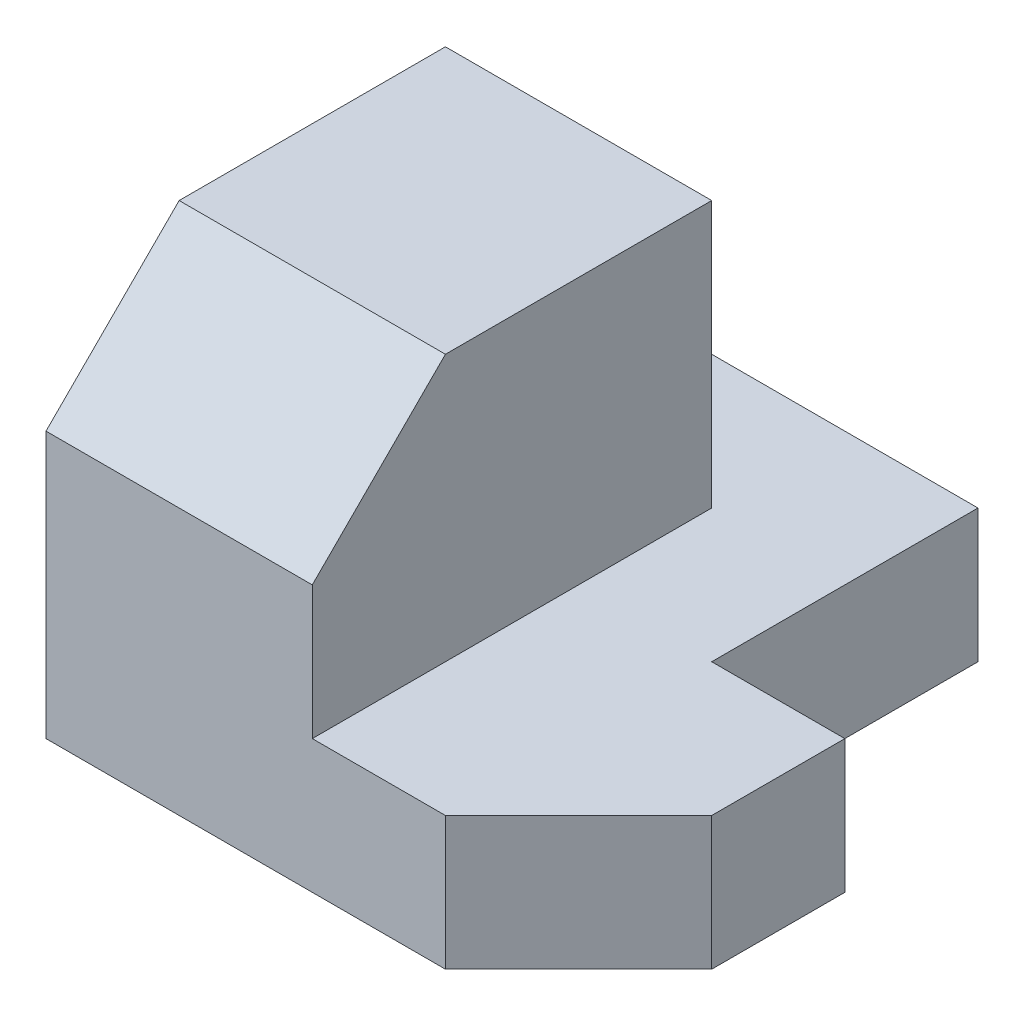
ISO-10303-21;
HEADER;
FILE_DESCRIPTION(('STEP AP214'),'2;1');
FILE_NAME('part.step','',(''),(''),'','','');
FILE_SCHEMA(('AUTOMOTIVE_DESIGN { 1 0 10303 214 1 1 1 1 }'));
ENDSEC;
DATA;
#1=APPLICATION_CONTEXT('core data for automotive mechanical design processes');
#2=APPLICATION_PROTOCOL_DEFINITION('international standard','automotive_design',2000,#1);
#3=PRODUCT_CONTEXT('',#1,'mechanical');
#4=PRODUCT('Part','Part','',(#3));
#5=PRODUCT_RELATED_PRODUCT_CATEGORY('part','',(#4));
#6=PRODUCT_DEFINITION_FORMATION('','',#4);
#7=PRODUCT_DEFINITION_CONTEXT('part definition',#1,'design');
#8=PRODUCT_DEFINITION('design','',#6,#7);
#9=PRODUCT_DEFINITION_SHAPE('','',#8);
#10=(LENGTH_UNIT() NAMED_UNIT(*) SI_UNIT(.MILLI.,.METRE.));
#11=(NAMED_UNIT(*) PLANE_ANGLE_UNIT() SI_UNIT($,.RADIAN.));
#12=(NAMED_UNIT(*) SI_UNIT($,.STERADIAN.) SOLID_ANGLE_UNIT());
#13=UNCERTAINTY_MEASURE_WITH_UNIT(LENGTH_MEASURE(1.E-05),#10,'distance_accuracy_value','');
#14=(GEOMETRIC_REPRESENTATION_CONTEXT(3) GLOBAL_UNCERTAINTY_ASSIGNED_CONTEXT((#13)) GLOBAL_UNIT_ASSIGNED_CONTEXT((#10,
#11,#12)) REPRESENTATION_CONTEXT('',''));
#15=CARTESIAN_POINT('',(0.,0.,0.));
#16=DIRECTION('',(0.,0.,1.));
#17=DIRECTION('',(1.,0.,0.));
#18=AXIS2_PLACEMENT_3D('',#15,#16,#17);
#19=CARTESIAN_POINT('',(0.,5.,0.));
#20=DIRECTION('',(0.,-1.,0.));
#21=DIRECTION('',(0.,0.,-1.));
#22=AXIS2_PLACEMENT_3D('',#19,#20,#21);
#23=PLANE('',#22);
#24=DIRECTION('',(-1.,0.,0.));
#25=VECTOR('',#24,1.);
#26=CARTESIAN_POINT('',(10.,5.,-15.));
#27=LINE('',#26,#25);
#28=CARTESIAN_POINT('',(10.,5.,-15.));
#29=VERTEX_POINT('',#28);
#30=CARTESIAN_POINT('',(0.,5.,-15.));
#31=VERTEX_POINT('',#30);
#32=EDGE_CURVE('E137',#29,#31,#27,.T.);
#33=ORIENTED_EDGE('',*,*,#32,.F.);
#34=DIRECTION('',(0.,0.,1.));
#35=VECTOR('',#34,1.);
#36=CARTESIAN_POINT('',(10.,5.,0.));
#37=LINE('',#36,#35);
#38=CARTESIAN_POINT('',(10.,5.,0.));
#39=VERTEX_POINT('',#38);
#40=EDGE_CURVE('E186',#29,#39,#37,.T.);
#41=ORIENTED_EDGE('',*,*,#40,.T.);
#42=DIRECTION('',(1.,0.,0.));
#43=VECTOR('',#42,1.);
#44=CARTESIAN_POINT('',(0.,5.,0.));
#45=LINE('',#44,#43);
#46=CARTESIAN_POINT('',(15.,5.,0.));
#47=VERTEX_POINT('',#46);
#48=EDGE_CURVE('E94',#39,#47,#45,.T.);
#49=ORIENTED_EDGE('',*,*,#48,.T.);
#50=DIRECTION('',(0.707106781186547,0.,-0.707106781186548));
#51=VECTOR('',#50,1.);
#52=CARTESIAN_POINT('',(20.,5.,-5.));
#53=LINE('',#52,#51);
#54=CARTESIAN_POINT('',(20.,5.,-5.));
#55=VERTEX_POINT('',#54);
#56=EDGE_CURVE('E159',#47,#55,#53,.T.);
#57=ORIENTED_EDGE('',*,*,#56,.T.);
#58=DIRECTION('',(0.,0.,-1.));
#59=VECTOR('',#58,1.);
#60=CARTESIAN_POINT('',(20.,5.,-5.));
#61=LINE('',#60,#59);
#62=CARTESIAN_POINT('',(20.,5.,-10.));
#63=VERTEX_POINT('',#62);
#64=EDGE_CURVE('E112',#55,#63,#61,.T.);
#65=ORIENTED_EDGE('',*,*,#64,.T.);
#66=DIRECTION('',(-1.,0.,0.));
#67=VECTOR('',#66,1.);
#68=CARTESIAN_POINT('',(15.,5.,-10.));
#69=LINE('',#68,#67);
#70=CARTESIAN_POINT('',(15.,5.,-10.));
#71=VERTEX_POINT('',#70);
#72=EDGE_CURVE('E105',#63,#71,#69,.T.);
#73=ORIENTED_EDGE('',*,*,#72,.T.);
#74=DIRECTION('',(0.,0.,-1.));
#75=VECTOR('',#74,1.);
#76=CARTESIAN_POINT('',(15.,5.,-20.));
#77=LINE('',#76,#75);
#78=CARTESIAN_POINT('',(15.,5.,-20.));
#79=VERTEX_POINT('',#78);
#80=EDGE_CURVE('E109',#71,#79,#77,.T.);
#81=ORIENTED_EDGE('',*,*,#80,.T.);
#82=DIRECTION('',(-1.,0.,0.));
#83=VECTOR('',#82,1.);
#84=CARTESIAN_POINT('',(0.,5.,-20.));
#85=LINE('',#84,#83);
#86=CARTESIAN_POINT('',(0.,5.,-20.));
#87=VERTEX_POINT('',#86);
#88=EDGE_CURVE('E57',#79,#87,#85,.T.);
#89=ORIENTED_EDGE('',*,*,#88,.T.);
#90=DIRECTION('',(0.,0.,1.));
#91=VECTOR('',#90,1.);
#92=CARTESIAN_POINT('',(0.,5.,0.));
#93=LINE('',#92,#91);
#94=EDGE_CURVE('E147',#87,#31,#93,.T.);
#95=ORIENTED_EDGE('',*,*,#94,.T.);
#96=EDGE_LOOP('',(#33,#41,#49,#57,#65,#73,#81,#89,#95));
#97=FACE_BOUND('',#96,.T.);
#98=ADVANCED_FACE('F33',(#97),#23,.F.);
#99=CARTESIAN_POINT('',(0.,5.,0.));
#100=DIRECTION('',(1.,0.,0.));
#101=DIRECTION('',(0.,0.,-1.));
#102=AXIS2_PLACEMENT_3D('',#99,#100,#101);
#103=PLANE('',#102);
#104=DIRECTION('',(0.,0.,1.));
#105=VECTOR('',#104,1.);
#106=CARTESIAN_POINT('',(0.,0.,0.));
#107=LINE('',#106,#105);
#108=CARTESIAN_POINT('',(0.,0.,-20.));
#109=VERTEX_POINT('',#108);
#110=CARTESIAN_POINT('',(0.,0.,0.));
#111=VERTEX_POINT('',#110);
#112=EDGE_CURVE('E133',#109,#111,#107,.T.);
#113=ORIENTED_EDGE('',*,*,#112,.T.);
#114=DIRECTION('',(0.,-1.,0.));
#115=VECTOR('',#114,1.);
#116=CARTESIAN_POINT('',(0.,5.,0.));
#117=LINE('',#116,#115);
#118=CARTESIAN_POINT('',(0.,10.,0.));
#119=VERTEX_POINT('',#118);
#120=EDGE_CURVE('E11',#119,#111,#117,.T.);
#121=ORIENTED_EDGE('',*,*,#120,.F.);
#122=DIRECTION('',(0.,0.707106781186547,-0.707106781186548));
#123=VECTOR('',#122,1.);
#124=CARTESIAN_POINT('',(0.,15.,-5.));
#125=LINE('',#124,#123);
#126=CARTESIAN_POINT('',(0.,15.,-5.));
#127=VERTEX_POINT('',#126);
#128=EDGE_CURVE('E190',#119,#127,#125,.T.);
#129=ORIENTED_EDGE('',*,*,#128,.T.);
#130=DIRECTION('',(0.,0.,-1.));
#131=VECTOR('',#130,1.);
#132=CARTESIAN_POINT('',(0.,15.,-15.));
#133=LINE('',#132,#131);
#134=CARTESIAN_POINT('',(0.,15.,-15.));
#135=VERTEX_POINT('',#134);
#136=EDGE_CURVE('E187',#127,#135,#133,.T.);
#137=ORIENTED_EDGE('',*,*,#136,.T.);
#138=DIRECTION('',(0.,-1.,0.));
#139=VECTOR('',#138,1.);
#140=CARTESIAN_POINT('',(0.,5.,-15.));
#141=LINE('',#140,#139);
#142=EDGE_CURVE('E183',#135,#31,#141,.T.);
#143=ORIENTED_EDGE('',*,*,#142,.T.);
#144=ORIENTED_EDGE('',*,*,#94,.F.);
#145=DIRECTION('',(0.,-1.,0.));
#146=VECTOR('',#145,1.);
#147=CARTESIAN_POINT('',(0.,5.,-20.));
#148=LINE('',#147,#146);
#149=EDGE_CURVE('E129',#87,#109,#148,.T.);
#150=ORIENTED_EDGE('',*,*,#149,.T.);
#151=EDGE_LOOP('',(#113,#121,#129,#137,#143,#144,#150));
#152=FACE_BOUND('',#151,.T.);
#153=ADVANCED_FACE('F35',(#152),#103,.F.);
#154=CARTESIAN_POINT('',(0.,5.,0.));
#155=DIRECTION('',(0.,0.,-1.));
#156=DIRECTION('',(-1.,0.,0.));
#157=AXIS2_PLACEMENT_3D('',#154,#155,#156);
#158=PLANE('',#157);
#159=DIRECTION('',(1.,0.,0.));
#160=VECTOR('',#159,1.);
#161=CARTESIAN_POINT('',(0.,0.,0.));
#162=LINE('',#161,#160);
#163=CARTESIAN_POINT('',(15.,0.,0.));
#164=VERTEX_POINT('',#163);
#165=EDGE_CURVE('E136',#111,#164,#162,.T.);
#166=ORIENTED_EDGE('',*,*,#165,.T.);
#167=DIRECTION('',(0.,-1.,0.));
#168=VECTOR('',#167,1.);
#169=CARTESIAN_POINT('',(15.,5.,0.));
#170=LINE('',#169,#168);
#171=EDGE_CURVE('E41',#47,#164,#170,.T.);
#172=ORIENTED_EDGE('',*,*,#171,.F.);
#173=ORIENTED_EDGE('',*,*,#48,.F.);
#174=DIRECTION('',(0.,1.,0.));
#175=VECTOR('',#174,1.);
#176=CARTESIAN_POINT('',(10.,10.,0.));
#177=LINE('',#176,#175);
#178=CARTESIAN_POINT('',(10.,10.,0.));
#179=VERTEX_POINT('',#178);
#180=EDGE_CURVE('E48',#39,#179,#177,.T.);
#181=ORIENTED_EDGE('',*,*,#180,.T.);
#182=DIRECTION('',(-1.,0.,0.));
#183=VECTOR('',#182,1.);
#184=CARTESIAN_POINT('',(10.,10.,0.));
#185=LINE('',#184,#183);
#186=EDGE_CURVE('E171',#179,#119,#185,.T.);
#187=ORIENTED_EDGE('',*,*,#186,.T.);
#188=ORIENTED_EDGE('',*,*,#120,.T.);
#189=EDGE_LOOP('',(#166,#172,#173,#181,#187,#188));
#190=FACE_BOUND('',#189,.T.);
#191=ADVANCED_FACE('F203',(#190),#158,.F.);
#192=CARTESIAN_POINT('',(20.,5.,-5.));
#193=DIRECTION('',(-0.707106781186548,0.,-0.707106781186547));
#194=DIRECTION('',(-0.707106781186547,0.,0.707106781186548));
#195=AXIS2_PLACEMENT_3D('',#192,#193,#194);
#196=PLANE('',#195);
#197=DIRECTION('',(0.707106781186547,0.,-0.707106781186548));
#198=VECTOR('',#197,1.);
#199=CARTESIAN_POINT('',(20.,0.,-5.));
#200=LINE('',#199,#198);
#201=CARTESIAN_POINT('',(20.,0.,-5.));
#202=VERTEX_POINT('',#201);
#203=EDGE_CURVE('E139',#164,#202,#200,.T.);
#204=ORIENTED_EDGE('',*,*,#203,.T.);
#205=DIRECTION('',(0.,-1.,0.));
#206=VECTOR('',#205,1.);
#207=CARTESIAN_POINT('',(20.,5.,-5.));
#208=LINE('',#207,#206);
#209=EDGE_CURVE('E151',#55,#202,#208,.T.);
#210=ORIENTED_EDGE('',*,*,#209,.F.);
#211=ORIENTED_EDGE('',*,*,#56,.F.);
#212=ORIENTED_EDGE('',*,*,#171,.T.);
#213=EDGE_LOOP('',(#204,#210,#211,#212));
#214=FACE_BOUND('',#213,.T.);
#215=ADVANCED_FACE('F157',(#214),#196,.F.);
#216=CARTESIAN_POINT('',(20.,5.,-5.));
#217=DIRECTION('',(-1.,0.,0.));
#218=DIRECTION('',(0.,0.,1.));
#219=AXIS2_PLACEMENT_3D('',#216,#217,#218);
#220=PLANE('',#219);
#221=DIRECTION('',(0.,0.,-1.));
#222=VECTOR('',#221,1.);
#223=CARTESIAN_POINT('',(20.,0.,-5.));
#224=LINE('',#223,#222);
#225=CARTESIAN_POINT('',(20.,0.,-10.));
#226=VERTEX_POINT('',#225);
#227=EDGE_CURVE('E141',#202,#226,#224,.T.);
#228=ORIENTED_EDGE('',*,*,#227,.T.);
#229=DIRECTION('',(0.,-1.,0.));
#230=VECTOR('',#229,1.);
#231=CARTESIAN_POINT('',(20.,5.,-10.));
#232=LINE('',#231,#230);
#233=EDGE_CURVE('E124',#63,#226,#232,.T.);
#234=ORIENTED_EDGE('',*,*,#233,.F.);
#235=ORIENTED_EDGE('',*,*,#64,.F.);
#236=ORIENTED_EDGE('',*,*,#209,.T.);
#237=EDGE_LOOP('',(#228,#234,#235,#236));
#238=FACE_BOUND('',#237,.T.);
#239=ADVANCED_FACE('F166',(#238),#220,.F.);
#240=CARTESIAN_POINT('',(15.,5.,-10.));
#241=DIRECTION('',(0.,0.,1.));
#242=DIRECTION('',(1.,0.,0.));
#243=AXIS2_PLACEMENT_3D('',#240,#241,#242);
#244=PLANE('',#243);
#245=DIRECTION('',(-1.,0.,0.));
#246=VECTOR('',#245,1.);
#247=CARTESIAN_POINT('',(15.,0.,-10.));
#248=LINE('',#247,#246);
#249=CARTESIAN_POINT('',(15.,0.,-10.));
#250=VERTEX_POINT('',#249);
#251=EDGE_CURVE('E121',#226,#250,#248,.T.);
#252=ORIENTED_EDGE('',*,*,#251,.T.);
#253=DIRECTION('',(0.,-1.,0.));
#254=VECTOR('',#253,1.);
#255=CARTESIAN_POINT('',(15.,5.,-10.));
#256=LINE('',#255,#254);
#257=EDGE_CURVE('E118',#71,#250,#256,.T.);
#258=ORIENTED_EDGE('',*,*,#257,.F.);
#259=ORIENTED_EDGE('',*,*,#72,.F.);
#260=ORIENTED_EDGE('',*,*,#233,.T.);
#261=EDGE_LOOP('',(#252,#258,#259,#260));
#262=FACE_BOUND('',#261,.T.);
#263=ADVANCED_FACE('F119',(#262),#244,.F.);
#264=CARTESIAN_POINT('',(15.,5.,-20.));
#265=DIRECTION('',(-1.,0.,0.));
#266=DIRECTION('',(0.,0.,1.));
#267=AXIS2_PLACEMENT_3D('',#264,#265,#266);
#268=PLANE('',#267);
#269=DIRECTION('',(0.,0.,-1.));
#270=VECTOR('',#269,1.);
#271=CARTESIAN_POINT('',(15.,0.,-20.));
#272=LINE('',#271,#270);
#273=CARTESIAN_POINT('',(15.,0.,-20.));
#274=VERTEX_POINT('',#273);
#275=EDGE_CURVE('E144',#250,#274,#272,.T.);
#276=ORIENTED_EDGE('',*,*,#275,.T.);
#277=DIRECTION('',(0.,-1.,0.));
#278=VECTOR('',#277,1.);
#279=CARTESIAN_POINT('',(15.,5.,-20.));
#280=LINE('',#279,#278);
#281=EDGE_CURVE('E125',#79,#274,#280,.T.);
#282=ORIENTED_EDGE('',*,*,#281,.F.);
#283=ORIENTED_EDGE('',*,*,#80,.F.);
#284=ORIENTED_EDGE('',*,*,#257,.T.);
#285=EDGE_LOOP('',(#276,#282,#283,#284));
#286=FACE_BOUND('',#285,.T.);
#287=ADVANCED_FACE('F127',(#286),#268,.F.);
#288=CARTESIAN_POINT('',(0.,5.,-20.));
#289=DIRECTION('',(0.,0.,1.));
#290=DIRECTION('',(1.,0.,0.));
#291=AXIS2_PLACEMENT_3D('',#288,#289,#290);
#292=PLANE('',#291);
#293=DIRECTION('',(-1.,0.,0.));
#294=VECTOR('',#293,1.);
#295=CARTESIAN_POINT('',(0.,0.,-20.));
#296=LINE('',#295,#294);
#297=EDGE_CURVE('E87',#274,#109,#296,.T.);
#298=ORIENTED_EDGE('',*,*,#297,.T.);
#299=ORIENTED_EDGE('',*,*,#149,.F.);
#300=ORIENTED_EDGE('',*,*,#88,.F.);
#301=ORIENTED_EDGE('',*,*,#281,.T.);
#302=EDGE_LOOP('',(#298,#299,#300,#301));
#303=FACE_BOUND('',#302,.T.);
#304=ADVANCED_FACE('F249',(#303),#292,.F.);
#305=CARTESIAN_POINT('',(0.,0.,0.));
#306=DIRECTION('',(0.,-1.,0.));
#307=DIRECTION('',(0.,0.,-1.));
#308=AXIS2_PLACEMENT_3D('',#305,#306,#307);
#309=PLANE('',#308);
#310=ORIENTED_EDGE('',*,*,#112,.F.);
#311=ORIENTED_EDGE('',*,*,#297,.F.);
#312=ORIENTED_EDGE('',*,*,#275,.F.);
#313=ORIENTED_EDGE('',*,*,#251,.F.);
#314=ORIENTED_EDGE('',*,*,#227,.F.);
#315=ORIENTED_EDGE('',*,*,#203,.F.);
#316=ORIENTED_EDGE('',*,*,#165,.F.);
#317=EDGE_LOOP('',(#310,#311,#312,#313,#314,#315,#316));
#318=FACE_BOUND('',#317,.T.);
#319=ADVANCED_FACE('F164',(#318),#309,.T.);
#320=CARTESIAN_POINT('',(10.,5.,-15.));
#321=DIRECTION('',(0.,0.,-1.));
#322=DIRECTION('',(-1.,0.,0.));
#323=AXIS2_PLACEMENT_3D('',#320,#321,#322);
#324=PLANE('',#323);
#325=ORIENTED_EDGE('',*,*,#142,.F.);
#326=DIRECTION('',(-1.,0.,0.));
#327=VECTOR('',#326,1.);
#328=CARTESIAN_POINT('',(10.,15.,-15.));
#329=LINE('',#328,#327);
#330=CARTESIAN_POINT('',(10.,15.,-15.));
#331=VERTEX_POINT('',#330);
#332=EDGE_CURVE('E178',#331,#135,#329,.T.);
#333=ORIENTED_EDGE('',*,*,#332,.F.);
#334=DIRECTION('',(0.,-1.,0.));
#335=VECTOR('',#334,1.);
#336=CARTESIAN_POINT('',(10.,5.,-15.));
#337=LINE('',#336,#335);
#338=EDGE_CURVE('E175',#331,#29,#337,.T.);
#339=ORIENTED_EDGE('',*,*,#338,.T.);
#340=ORIENTED_EDGE('',*,*,#32,.T.);
#341=EDGE_LOOP('',(#325,#333,#339,#340));
#342=FACE_BOUND('',#341,.T.);
#343=ADVANCED_FACE('F230',(#342),#324,.T.);
#344=CARTESIAN_POINT('',(10.,15.,-15.));
#345=DIRECTION('',(0.,1.,0.));
#346=DIRECTION('',(0.,0.,1.));
#347=AXIS2_PLACEMENT_3D('',#344,#345,#346);
#348=PLANE('',#347);
#349=ORIENTED_EDGE('',*,*,#136,.F.);
#350=DIRECTION('',(-1.,0.,0.));
#351=VECTOR('',#350,1.);
#352=CARTESIAN_POINT('',(10.,15.,-5.));
#353=LINE('',#352,#351);
#354=CARTESIAN_POINT('',(10.,15.,-5.));
#355=VERTEX_POINT('',#354);
#356=EDGE_CURVE('E174',#355,#127,#353,.T.);
#357=ORIENTED_EDGE('',*,*,#356,.F.);
#358=DIRECTION('',(0.,0.,-1.));
#359=VECTOR('',#358,1.);
#360=CARTESIAN_POINT('',(10.,15.,-15.));
#361=LINE('',#360,#359);
#362=EDGE_CURVE('E195',#355,#331,#361,.T.);
#363=ORIENTED_EDGE('',*,*,#362,.T.);
#364=ORIENTED_EDGE('',*,*,#332,.T.);
#365=EDGE_LOOP('',(#349,#357,#363,#364));
#366=FACE_BOUND('',#365,.T.);
#367=ADVANCED_FACE('F224',(#366),#348,.T.);
#368=CARTESIAN_POINT('',(10.,15.,-5.));
#369=DIRECTION('',(0.,0.707106781186548,0.707106781186547));
#370=DIRECTION('',(0.,-0.707106781186547,0.707106781186548));
#371=AXIS2_PLACEMENT_3D('',#368,#369,#370);
#372=PLANE('',#371);
#373=ORIENTED_EDGE('',*,*,#128,.F.);
#374=ORIENTED_EDGE('',*,*,#186,.F.);
#375=DIRECTION('',(0.,0.707106781186547,-0.707106781186548));
#376=VECTOR('',#375,1.);
#377=CARTESIAN_POINT('',(10.,15.,-5.));
#378=LINE('',#377,#376);
#379=EDGE_CURVE('E198',#179,#355,#378,.T.);
#380=ORIENTED_EDGE('',*,*,#379,.T.);
#381=ORIENTED_EDGE('',*,*,#356,.T.);
#382=EDGE_LOOP('',(#373,#374,#380,#381));
#383=FACE_BOUND('',#382,.T.);
#384=ADVANCED_FACE('F232',(#383),#372,.T.);
#385=CARTESIAN_POINT('',(10.,0.,0.));
#386=DIRECTION('',(1.,0.,0.));
#387=DIRECTION('',(0.,0.,-1.));
#388=AXIS2_PLACEMENT_3D('',#385,#386,#387);
#389=PLANE('',#388);
#390=ORIENTED_EDGE('',*,*,#40,.F.);
#391=ORIENTED_EDGE('',*,*,#338,.F.);
#392=ORIENTED_EDGE('',*,*,#362,.F.);
#393=ORIENTED_EDGE('',*,*,#379,.F.);
#394=ORIENTED_EDGE('',*,*,#180,.F.);
#395=EDGE_LOOP('',(#390,#391,#392,#393,#394));
#396=FACE_BOUND('',#395,.T.);
#397=ADVANCED_FACE('F231',(#396),#389,.T.);
#398=CLOSED_SHELL('',(#98,#153,#191,#215,#239,#263,#287,#304,#319,#343,#367,#384,#397));
#399=MANIFOLD_SOLID_BREP('B2',#398);
#400=ADVANCED_BREP_SHAPE_REPRESENTATION('',(#18,#399),#14);
#401=SHAPE_DEFINITION_REPRESENTATION(#9,#400);
ENDSEC;
END-ISO-10303-21;
